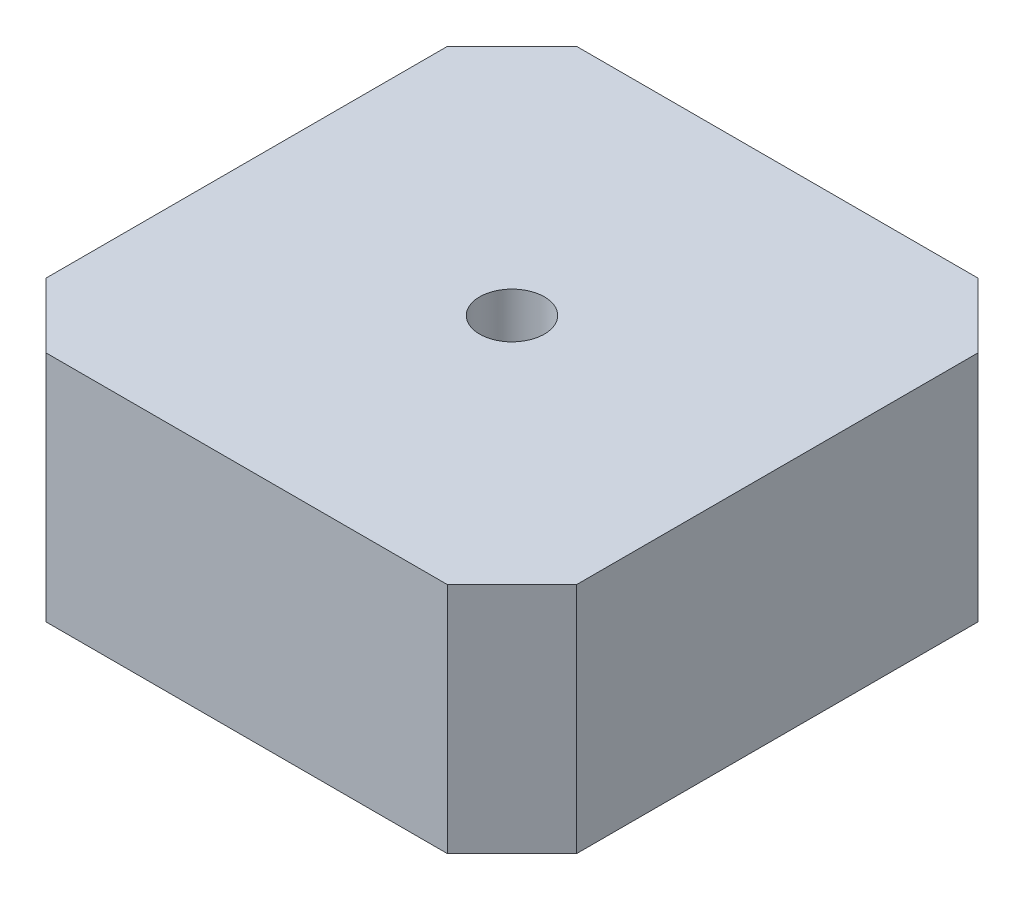
ISO-10303-21;
HEADER;
FILE_DESCRIPTION(('STEP AP214'),'2;1');
FILE_NAME('part.step','',(''),(''),'','','');
FILE_SCHEMA(('AUTOMOTIVE_DESIGN { 1 0 10303 214 1 1 1 1 }'));
ENDSEC;
DATA;
#1=APPLICATION_CONTEXT('core data for automotive mechanical design processes');
#2=APPLICATION_PROTOCOL_DEFINITION('international standard','automotive_design',2000,#1);
#3=PRODUCT_CONTEXT('',#1,'mechanical');
#4=PRODUCT('Part','Part','',(#3));
#5=PRODUCT_RELATED_PRODUCT_CATEGORY('part','',(#4));
#6=PRODUCT_DEFINITION_FORMATION('','',#4);
#7=PRODUCT_DEFINITION_CONTEXT('part definition',#1,'design');
#8=PRODUCT_DEFINITION('design','',#6,#7);
#9=PRODUCT_DEFINITION_SHAPE('','',#8);
#10=(LENGTH_UNIT() NAMED_UNIT(*) SI_UNIT(.MILLI.,.METRE.));
#11=(NAMED_UNIT(*) PLANE_ANGLE_UNIT() SI_UNIT($,.RADIAN.));
#12=(NAMED_UNIT(*) SI_UNIT($,.STERADIAN.) SOLID_ANGLE_UNIT());
#13=UNCERTAINTY_MEASURE_WITH_UNIT(LENGTH_MEASURE(1.E-05),#10,'distance_accuracy_value','');
#14=(GEOMETRIC_REPRESENTATION_CONTEXT(3) GLOBAL_UNCERTAINTY_ASSIGNED_CONTEXT((#13)) GLOBAL_UNIT_ASSIGNED_CONTEXT((#10,
#11,#12)) REPRESENTATION_CONTEXT('',''));
#15=CARTESIAN_POINT('',(0.,0.,0.));
#16=DIRECTION('',(0.,0.,1.));
#17=DIRECTION('',(1.,0.,0.));
#18=AXIS2_PLACEMENT_3D('',#15,#16,#17);
#19=CARTESIAN_POINT('',(0.,0.,0.));
#20=DIRECTION('',(0.,1.,0.));
#21=DIRECTION('',(0.,0.,1.));
#22=AXIS2_PLACEMENT_3D('',#19,#20,#21);
#23=PLANE('',#22);
#24=DIRECTION('',(0.707106781186545,0.,-0.70710678118655));
#25=VECTOR('',#24,1.);
#26=CARTESIAN_POINT('',(36.,0.,0.));
#27=LINE('',#26,#25);
#28=CARTESIAN_POINT('',(36.,0.,0.));
#29=VERTEX_POINT('',#28);
#30=CARTESIAN_POINT('',(41.,0.,-5.00000000000001));
#31=VERTEX_POINT('',#30);
#32=EDGE_CURVE('E145',#29,#31,#27,.T.);
#33=ORIENTED_EDGE('',*,*,#32,.F.);
#34=DIRECTION('',(1.,0.,0.));
#35=VECTOR('',#34,1.);
#36=CARTESIAN_POINT('',(5.00000000000001,0.,0.));
#37=LINE('',#36,#35);
#38=CARTESIAN_POINT('',(5.00000000000001,0.,0.));
#39=VERTEX_POINT('',#38);
#40=EDGE_CURVE('E112',#39,#29,#37,.T.);
#41=ORIENTED_EDGE('',*,*,#40,.F.);
#42=DIRECTION('',(0.70710678118655,0.,0.707106781186545));
#43=VECTOR('',#42,1.);
#44=CARTESIAN_POINT('',(0.,0.,-4.99999999999995));
#45=LINE('',#44,#43);
#46=CARTESIAN_POINT('',(0.,0.,-4.99999999999995));
#47=VERTEX_POINT('',#46);
#48=EDGE_CURVE('E118',#47,#39,#45,.T.);
#49=ORIENTED_EDGE('',*,*,#48,.F.);
#50=DIRECTION('',(0.,0.,1.));
#51=VECTOR('',#50,1.);
#52=CARTESIAN_POINT('',(0.,0.,-36.));
#53=LINE('',#52,#51);
#54=CARTESIAN_POINT('',(0.,0.,-36.));
#55=VERTEX_POINT('',#54);
#56=EDGE_CURVE('E158',#55,#47,#53,.T.);
#57=ORIENTED_EDGE('',*,*,#56,.F.);
#58=DIRECTION('',(-0.707106781186546,0.,0.707106781186549));
#59=VECTOR('',#58,1.);
#60=CARTESIAN_POINT('',(5.00000000000001,0.,-41.));
#61=LINE('',#60,#59);
#62=CARTESIAN_POINT('',(5.00000000000001,0.,-41.));
#63=VERTEX_POINT('',#62);
#64=EDGE_CURVE('E152',#63,#55,#61,.T.);
#65=ORIENTED_EDGE('',*,*,#64,.F.);
#66=DIRECTION('',(-1.,0.,0.));
#67=VECTOR('',#66,1.);
#68=CARTESIAN_POINT('',(36.,0.,-41.));
#69=LINE('',#68,#67);
#70=CARTESIAN_POINT('',(36.,0.,-41.));
#71=VERTEX_POINT('',#70);
#72=EDGE_CURVE('E150',#71,#63,#69,.T.);
#73=ORIENTED_EDGE('',*,*,#72,.F.);
#74=DIRECTION('',(-0.707106781186549,0.,-0.707106781186546));
#75=VECTOR('',#74,1.);
#76=CARTESIAN_POINT('',(41.,0.,-36.));
#77=LINE('',#76,#75);
#78=CARTESIAN_POINT('',(41.,0.,-36.));
#79=VERTEX_POINT('',#78);
#80=EDGE_CURVE('E137',#79,#71,#77,.T.);
#81=ORIENTED_EDGE('',*,*,#80,.F.);
#82=DIRECTION('',(0.,0.,-1.));
#83=VECTOR('',#82,1.);
#84=CARTESIAN_POINT('',(41.,0.,-5.00000000000001));
#85=LINE('',#84,#83);
#86=EDGE_CURVE('E142',#31,#79,#85,.T.);
#87=ORIENTED_EDGE('',*,*,#86,.F.);
#88=EDGE_LOOP('',(#33,#41,#49,#57,#65,#73,#81,#87));
#89=FACE_BOUND('',#88,.T.);
#90=CARTESIAN_POINT('',(20.5,0.,-20.5));
#91=DIRECTION('',(0.,1.,0.));
#92=DIRECTION('',(0.,0.,1.));
#93=AXIS2_PLACEMENT_3D('',#90,#91,#92);
#94=CIRCLE('',#93,2.5);
#95=CARTESIAN_POINT('',(20.5,0.,-18.));
#96=VERTEX_POINT('',#95);
#97=EDGE_CURVE('E107',#96,#96,#94,.T.);
#98=ORIENTED_EDGE('',*,*,#97,.T.);
#99=EDGE_LOOP('',(#98));
#100=FACE_BOUND('',#99,.T.);
#101=ADVANCED_FACE('F35',(#89,#100),#23,.F.);
#102=CARTESIAN_POINT('',(36.,28.,0.));
#103=DIRECTION('',(-0.70710678118655,0.,-0.707106781186545));
#104=DIRECTION('',(-0.707106781186545,0.,0.70710678118655));
#105=AXIS2_PLACEMENT_3D('',#102,#103,#104);
#106=PLANE('',#105);
#107=DIRECTION('',(0.,-1.,0.));
#108=VECTOR('',#107,1.);
#109=CARTESIAN_POINT('',(41.,28.,-5.00000000000001));
#110=LINE('',#109,#108);
#111=CARTESIAN_POINT('',(41.,18.,-5.00000000000001));
#112=VERTEX_POINT('',#111);
#113=EDGE_CURVE('E11',#112,#31,#110,.T.);
#114=ORIENTED_EDGE('',*,*,#113,.F.);
#115=DIRECTION('',(-0.707106781186545,0.,0.70710678118655));
#116=VECTOR('',#115,1.);
#117=CARTESIAN_POINT('',(36.,18.,0.));
#118=LINE('',#117,#116);
#119=CARTESIAN_POINT('',(36.,18.,0.));
#120=VERTEX_POINT('',#119);
#121=EDGE_CURVE('E101',#112,#120,#118,.T.);
#122=ORIENTED_EDGE('',*,*,#121,.T.);
#123=DIRECTION('',(0.,-1.,0.));
#124=VECTOR('',#123,1.);
#125=CARTESIAN_POINT('',(36.,28.,0.));
#126=LINE('',#125,#124);
#127=EDGE_CURVE('E59',#120,#29,#126,.T.);
#128=ORIENTED_EDGE('',*,*,#127,.T.);
#129=ORIENTED_EDGE('',*,*,#32,.T.);
#130=EDGE_LOOP('',(#114,#122,#128,#129));
#131=FACE_BOUND('',#130,.T.);
#132=ADVANCED_FACE('F37',(#131),#106,.F.);
#133=CARTESIAN_POINT('',(41.,28.,-5.00000000000001));
#134=DIRECTION('',(-1.,0.,0.));
#135=DIRECTION('',(0.,0.,1.));
#136=AXIS2_PLACEMENT_3D('',#133,#134,#135);
#137=PLANE('',#136);
#138=DIRECTION('',(0.,-1.,0.));
#139=VECTOR('',#138,1.);
#140=CARTESIAN_POINT('',(41.,28.,-36.));
#141=LINE('',#140,#139);
#142=CARTESIAN_POINT('',(41.,18.,-36.));
#143=VERTEX_POINT('',#142);
#144=EDGE_CURVE('E44',#143,#79,#141,.T.);
#145=ORIENTED_EDGE('',*,*,#144,.F.);
#146=DIRECTION('',(0.,0.,1.));
#147=VECTOR('',#146,1.);
#148=CARTESIAN_POINT('',(41.,18.,-5.00000000000001));
#149=LINE('',#148,#147);
#150=EDGE_CURVE('E108',#143,#112,#149,.T.);
#151=ORIENTED_EDGE('',*,*,#150,.T.);
#152=ORIENTED_EDGE('',*,*,#113,.T.);
#153=ORIENTED_EDGE('',*,*,#86,.T.);
#154=EDGE_LOOP('',(#145,#151,#152,#153));
#155=FACE_BOUND('',#154,.T.);
#156=ADVANCED_FACE('F143',(#155),#137,.F.);
#157=CARTESIAN_POINT('',(41.,28.,-36.));
#158=DIRECTION('',(-0.707106781186546,0.,0.707106781186549));
#159=DIRECTION('',(0.707106781186549,0.,0.707106781186546));
#160=AXIS2_PLACEMENT_3D('',#157,#158,#159);
#161=PLANE('',#160);
#162=DIRECTION('',(0.,-1.,0.));
#163=VECTOR('',#162,1.);
#164=CARTESIAN_POINT('',(36.,28.,-41.));
#165=LINE('',#164,#163);
#166=CARTESIAN_POINT('',(36.,18.,-41.));
#167=VERTEX_POINT('',#166);
#168=EDGE_CURVE('E127',#167,#71,#165,.T.);
#169=ORIENTED_EDGE('',*,*,#168,.F.);
#170=DIRECTION('',(0.707106781186549,0.,0.707106781186546));
#171=VECTOR('',#170,1.);
#172=CARTESIAN_POINT('',(41.,18.,-36.));
#173=LINE('',#172,#171);
#174=EDGE_CURVE('E139',#167,#143,#173,.T.);
#175=ORIENTED_EDGE('',*,*,#174,.T.);
#176=ORIENTED_EDGE('',*,*,#144,.T.);
#177=ORIENTED_EDGE('',*,*,#80,.T.);
#178=EDGE_LOOP('',(#169,#175,#176,#177));
#179=FACE_BOUND('',#178,.T.);
#180=ADVANCED_FACE('F135',(#179),#161,.F.);
#181=CARTESIAN_POINT('',(36.,28.,-41.));
#182=DIRECTION('',(0.,0.,1.));
#183=DIRECTION('',(1.,0.,0.));
#184=AXIS2_PLACEMENT_3D('',#181,#182,#183);
#185=PLANE('',#184);
#186=DIRECTION('',(0.,-1.,0.));
#187=VECTOR('',#186,1.);
#188=CARTESIAN_POINT('',(5.00000000000001,28.,-41.));
#189=LINE('',#188,#187);
#190=CARTESIAN_POINT('',(5.00000000000001,18.,-41.));
#191=VERTEX_POINT('',#190);
#192=EDGE_CURVE('E125',#191,#63,#189,.T.);
#193=ORIENTED_EDGE('',*,*,#192,.F.);
#194=DIRECTION('',(1.,0.,0.));
#195=VECTOR('',#194,1.);
#196=CARTESIAN_POINT('',(36.,18.,-41.));
#197=LINE('',#196,#195);
#198=EDGE_CURVE('E171',#191,#167,#197,.T.);
#199=ORIENTED_EDGE('',*,*,#198,.T.);
#200=ORIENTED_EDGE('',*,*,#168,.T.);
#201=ORIENTED_EDGE('',*,*,#72,.T.);
#202=EDGE_LOOP('',(#193,#199,#200,#201));
#203=FACE_BOUND('',#202,.T.);
#204=ADVANCED_FACE('F187',(#203),#185,.F.);
#205=CARTESIAN_POINT('',(5.00000000000001,28.,-41.));
#206=DIRECTION('',(0.707106781186549,0.,0.707106781186546));
#207=DIRECTION('',(0.707106781186546,0.,-0.707106781186549));
#208=AXIS2_PLACEMENT_3D('',#205,#206,#207);
#209=PLANE('',#208);
#210=DIRECTION('',(0.,-1.,0.));
#211=VECTOR('',#210,1.);
#212=CARTESIAN_POINT('',(0.,28.,-36.));
#213=LINE('',#212,#211);
#214=CARTESIAN_POINT('',(0.,18.,-36.));
#215=VERTEX_POINT('',#214);
#216=EDGE_CURVE('E123',#215,#55,#213,.T.);
#217=ORIENTED_EDGE('',*,*,#216,.F.);
#218=DIRECTION('',(0.707106781186546,0.,-0.707106781186549));
#219=VECTOR('',#218,1.);
#220=CARTESIAN_POINT('',(5.00000000000001,18.,-41.));
#221=LINE('',#220,#219);
#222=EDGE_CURVE('E174',#215,#191,#221,.T.);
#223=ORIENTED_EDGE('',*,*,#222,.T.);
#224=ORIENTED_EDGE('',*,*,#192,.T.);
#225=ORIENTED_EDGE('',*,*,#64,.T.);
#226=EDGE_LOOP('',(#217,#223,#224,#225));
#227=FACE_BOUND('',#226,.T.);
#228=ADVANCED_FACE('F184',(#227),#209,.F.);
#229=CARTESIAN_POINT('',(0.,28.,-36.));
#230=DIRECTION('',(1.,0.,0.));
#231=DIRECTION('',(0.,0.,-1.));
#232=AXIS2_PLACEMENT_3D('',#229,#230,#231);
#233=PLANE('',#232);
#234=DIRECTION('',(0.,-1.,0.));
#235=VECTOR('',#234,1.);
#236=CARTESIAN_POINT('',(0.,28.,-4.99999999999995));
#237=LINE('',#236,#235);
#238=CARTESIAN_POINT('',(0.,18.,-4.99999999999995));
#239=VERTEX_POINT('',#238);
#240=EDGE_CURVE('E116',#239,#47,#237,.T.);
#241=ORIENTED_EDGE('',*,*,#240,.F.);
#242=DIRECTION('',(0.,0.,-1.));
#243=VECTOR('',#242,1.);
#244=CARTESIAN_POINT('',(0.,18.,-36.));
#245=LINE('',#244,#243);
#246=EDGE_CURVE('E177',#239,#215,#245,.T.);
#247=ORIENTED_EDGE('',*,*,#246,.T.);
#248=ORIENTED_EDGE('',*,*,#216,.T.);
#249=ORIENTED_EDGE('',*,*,#56,.T.);
#250=EDGE_LOOP('',(#241,#247,#248,#249));
#251=FACE_BOUND('',#250,.T.);
#252=ADVANCED_FACE('F181',(#251),#233,.F.);
#253=CARTESIAN_POINT('',(0.,28.,-4.99999999999995));
#254=DIRECTION('',(0.707106781186545,0.,-0.70710678118655));
#255=DIRECTION('',(-0.70710678118655,0.,-0.707106781186545));
#256=AXIS2_PLACEMENT_3D('',#253,#254,#255);
#257=PLANE('',#256);
#258=DIRECTION('',(0.,-1.,0.));
#259=VECTOR('',#258,1.);
#260=CARTESIAN_POINT('',(5.00000000000001,28.,0.));
#261=LINE('',#260,#259);
#262=CARTESIAN_POINT('',(5.00000000000001,18.,0.));
#263=VERTEX_POINT('',#262);
#264=EDGE_CURVE('E114',#263,#39,#261,.T.);
#265=ORIENTED_EDGE('',*,*,#264,.F.);
#266=DIRECTION('',(-0.70710678118655,0.,-0.707106781186545));
#267=VECTOR('',#266,1.);
#268=CARTESIAN_POINT('',(0.,18.,-4.99999999999995));
#269=LINE('',#268,#267);
#270=EDGE_CURVE('E51',#263,#239,#269,.T.);
#271=ORIENTED_EDGE('',*,*,#270,.T.);
#272=ORIENTED_EDGE('',*,*,#240,.T.);
#273=ORIENTED_EDGE('',*,*,#48,.T.);
#274=EDGE_LOOP('',(#265,#271,#272,#273));
#275=FACE_BOUND('',#274,.T.);
#276=ADVANCED_FACE('F163',(#275),#257,.F.);
#277=CARTESIAN_POINT('',(5.00000000000001,28.,0.));
#278=DIRECTION('',(0.,0.,-1.));
#279=DIRECTION('',(-1.,0.,0.));
#280=AXIS2_PLACEMENT_3D('',#277,#278,#279);
#281=PLANE('',#280);
#282=ORIENTED_EDGE('',*,*,#127,.F.);
#283=DIRECTION('',(-1.,0.,0.));
#284=VECTOR('',#283,1.);
#285=CARTESIAN_POINT('',(5.00000000000001,18.,0.));
#286=LINE('',#285,#284);
#287=EDGE_CURVE('E99',#120,#263,#286,.T.);
#288=ORIENTED_EDGE('',*,*,#287,.T.);
#289=ORIENTED_EDGE('',*,*,#264,.T.);
#290=ORIENTED_EDGE('',*,*,#40,.T.);
#291=EDGE_LOOP('',(#282,#288,#289,#290));
#292=FACE_BOUND('',#291,.T.);
#293=ADVANCED_FACE('F110',(#292),#281,.F.);
#294=CARTESIAN_POINT('',(20.5,28.,-20.5));
#295=DIRECTION('',(0.,-1.,0.));
#296=DIRECTION('',(0.,0.,-1.));
#297=AXIS2_PLACEMENT_3D('',#294,#295,#296);
#298=CYLINDRICAL_SURFACE('',#297,2.5);
#299=CARTESIAN_POINT('',(20.5,18.,-20.5));
#300=DIRECTION('',(0.,-1.,0.));
#301=DIRECTION('',(0.,0.,-1.));
#302=AXIS2_PLACEMENT_3D('',#299,#300,#301);
#303=CIRCLE('',#302,2.5);
#304=CARTESIAN_POINT('',(20.5,18.,-22.9999999999999));
#305=VERTEX_POINT('',#304);
#306=EDGE_CURVE('E39',#305,#305,#303,.T.);
#307=ORIENTED_EDGE('',*,*,#306,.F.);
#308=EDGE_LOOP('',(#307));
#309=FACE_BOUND('',#308,.T.);
#310=ORIENTED_EDGE('',*,*,#97,.F.);
#311=EDGE_LOOP('',(#310));
#312=FACE_BOUND('',#311,.T.);
#313=ADVANCED_FACE('F204',(#309,#312),#298,.F.);
#314=CARTESIAN_POINT('',(0.,18.,0.));
#315=DIRECTION('',(0.,-1.,0.));
#316=DIRECTION('',(0.,0.,-1.));
#317=AXIS2_PLACEMENT_3D('',#314,#315,#316);
#318=PLANE('',#317);
#319=ORIENTED_EDGE('',*,*,#306,.T.);
#320=EDGE_LOOP('',(#319));
#321=FACE_BOUND('',#320,.T.);
#322=ORIENTED_EDGE('',*,*,#150,.F.);
#323=ORIENTED_EDGE('',*,*,#174,.F.);
#324=ORIENTED_EDGE('',*,*,#198,.F.);
#325=ORIENTED_EDGE('',*,*,#222,.F.);
#326=ORIENTED_EDGE('',*,*,#246,.F.);
#327=ORIENTED_EDGE('',*,*,#270,.F.);
#328=ORIENTED_EDGE('',*,*,#287,.F.);
#329=ORIENTED_EDGE('',*,*,#121,.F.);
#330=EDGE_LOOP('',(#322,#323,#324,#325,#326,#327,#328,#329));
#331=FACE_BOUND('',#330,.T.);
#332=ADVANCED_FACE('F100',(#321,#331),#318,.F.);
#333=CLOSED_SHELL('',(#101,#132,#156,#180,#204,#228,#252,#276,#293,#313,#332));
#334=MANIFOLD_SOLID_BREP('B2',#333);
#335=ADVANCED_BREP_SHAPE_REPRESENTATION('',(#18,#334),#14);
#336=SHAPE_DEFINITION_REPRESENTATION(#9,#335);
ENDSEC;
END-ISO-10303-21;
